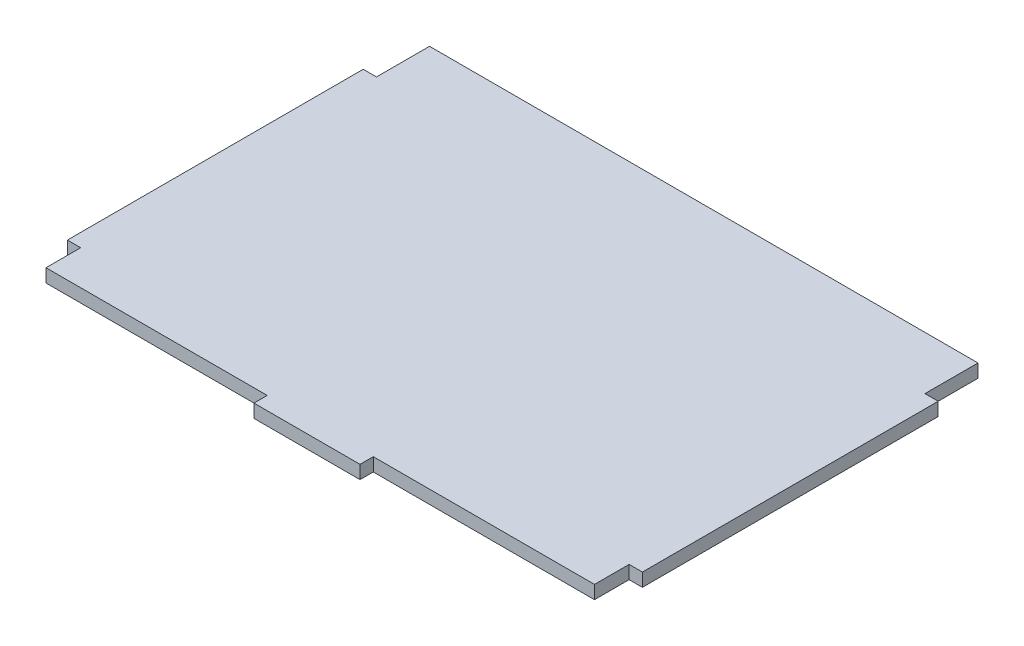
ISO-10303-21;
HEADER;
FILE_DESCRIPTION(('STEP AP214'),'2;1');
FILE_NAME('part.step','',(''),(''),'','','');
FILE_SCHEMA(('AUTOMOTIVE_DESIGN { 1 0 10303 214 1 1 1 1 }'));
ENDSEC;
DATA;
#1=APPLICATION_CONTEXT('core data for automotive mechanical design processes');
#2=APPLICATION_PROTOCOL_DEFINITION('international standard','automotive_design',2000,#1);
#3=PRODUCT_CONTEXT('',#1,'mechanical');
#4=PRODUCT('Part','Part','',(#3));
#5=PRODUCT_RELATED_PRODUCT_CATEGORY('part','',(#4));
#6=PRODUCT_DEFINITION_FORMATION('','',#4);
#7=PRODUCT_DEFINITION_CONTEXT('part definition',#1,'design');
#8=PRODUCT_DEFINITION('design','',#6,#7);
#9=PRODUCT_DEFINITION_SHAPE('','',#8);
#10=(LENGTH_UNIT() NAMED_UNIT(*) SI_UNIT(.MILLI.,.METRE.));
#11=(NAMED_UNIT(*) PLANE_ANGLE_UNIT() SI_UNIT($,.RADIAN.));
#12=(NAMED_UNIT(*) SI_UNIT($,.STERADIAN.) SOLID_ANGLE_UNIT());
#13=UNCERTAINTY_MEASURE_WITH_UNIT(LENGTH_MEASURE(1.E-05),#10,'distance_accuracy_value','');
#14=(GEOMETRIC_REPRESENTATION_CONTEXT(3) GLOBAL_UNCERTAINTY_ASSIGNED_CONTEXT((#13)) GLOBAL_UNIT_ASSIGNED_CONTEXT((#10,
#11,#12)) REPRESENTATION_CONTEXT('',''));
#15=CARTESIAN_POINT('',(0.,0.,0.));
#16=DIRECTION('',(0.,0.,1.));
#17=DIRECTION('',(1.,0.,0.));
#18=AXIS2_PLACEMENT_3D('',#15,#16,#17);
#19=CARTESIAN_POINT('',(12.7,3.175,47.498));
#20=DIRECTION('',(0.,0.,-1.));
#21=DIRECTION('',(-1.,0.,0.));
#22=AXIS2_PLACEMENT_3D('',#19,#20,#21);
#23=PLANE('',#22);
#24=DIRECTION('',(1.,0.,0.));
#25=VECTOR('',#24,1.);
#26=CARTESIAN_POINT('',(12.7,0.,47.498));
#27=LINE('',#26,#25);
#28=CARTESIAN_POINT('',(12.7,0.,47.498));
#29=VERTEX_POINT('',#28);
#30=CARTESIAN_POINT('',(65.659,0.,47.498));
#31=VERTEX_POINT('',#30);
#32=EDGE_CURVE('E177',#29,#31,#27,.T.);
#33=ORIENTED_EDGE('',*,*,#32,.T.);
#34=DIRECTION('',(0.,-1.,0.));
#35=VECTOR('',#34,1.);
#36=CARTESIAN_POINT('',(65.659,3.175,47.498));
#37=LINE('',#36,#35);
#38=CARTESIAN_POINT('',(65.659,3.175,47.498));
#39=VERTEX_POINT('',#38);
#40=EDGE_CURVE('E11',#39,#31,#37,.T.);
#41=ORIENTED_EDGE('',*,*,#40,.F.);
#42=DIRECTION('',(1.,0.,0.));
#43=VECTOR('',#42,1.);
#44=CARTESIAN_POINT('',(12.7,3.175,47.498));
#45=LINE('',#44,#43);
#46=CARTESIAN_POINT('',(12.7,3.175,47.498));
#47=VERTEX_POINT('',#46);
#48=EDGE_CURVE('E207',#47,#39,#45,.T.);
#49=ORIENTED_EDGE('',*,*,#48,.F.);
#50=DIRECTION('',(0.,-1.,0.));
#51=VECTOR('',#50,1.);
#52=CARTESIAN_POINT('',(12.7,3.175,47.498));
#53=LINE('',#52,#51);
#54=EDGE_CURVE('E173',#47,#29,#53,.T.);
#55=ORIENTED_EDGE('',*,*,#54,.T.);
#56=EDGE_LOOP('',(#33,#41,#49,#55));
#57=FACE_BOUND('',#56,.T.);
#58=ADVANCED_FACE('F33',(#57),#23,.F.);
#59=CARTESIAN_POINT('',(65.659,3.175,39.20277551));
#60=DIRECTION('',(-1.,0.,0.));
#61=DIRECTION('',(0.,0.,1.));
#62=AXIS2_PLACEMENT_3D('',#59,#60,#61);
#63=PLANE('',#62);
#64=DIRECTION('',(0.,0.,-1.));
#65=VECTOR('',#64,1.);
#66=CARTESIAN_POINT('',(65.659,0.,39.20277551));
#67=LINE('',#66,#65);
#68=CARTESIAN_POINT('',(65.659,0.,39.20277551));
#69=VERTEX_POINT('',#68);
#70=EDGE_CURVE('E180',#31,#69,#67,.T.);
#71=ORIENTED_EDGE('',*,*,#70,.T.);
#72=DIRECTION('',(0.,-1.,0.));
#73=VECTOR('',#72,1.);
#74=CARTESIAN_POINT('',(65.659,3.175,39.20277551));
#75=LINE('',#74,#73);
#76=CARTESIAN_POINT('',(65.659,3.175,39.20277551));
#77=VERTEX_POINT('',#76);
#78=EDGE_CURVE('E41',#77,#69,#75,.T.);
#79=ORIENTED_EDGE('',*,*,#78,.F.);
#80=DIRECTION('',(0.,0.,-1.));
#81=VECTOR('',#80,1.);
#82=CARTESIAN_POINT('',(65.659,3.175,39.20277551));
#83=LINE('',#82,#81);
#84=EDGE_CURVE('E116',#39,#77,#83,.T.);
#85=ORIENTED_EDGE('',*,*,#84,.F.);
#86=ORIENTED_EDGE('',*,*,#40,.T.);
#87=EDGE_LOOP('',(#71,#79,#85,#86));
#88=FACE_BOUND('',#87,.T.);
#89=ADVANCED_FACE('F305',(#88),#63,.F.);
#90=CARTESIAN_POINT('',(65.659,3.175,39.20277551));
#91=DIRECTION('',(0.,0.,-1.));
#92=DIRECTION('',(-1.,0.,0.));
#93=AXIS2_PLACEMENT_3D('',#90,#91,#92);
#94=PLANE('',#93);
#95=DIRECTION('',(1.,0.,0.));
#96=VECTOR('',#95,1.);
#97=CARTESIAN_POINT('',(65.659,0.,39.20277551));
#98=LINE('',#97,#96);
#99=CARTESIAN_POINT('',(68.834,0.,39.20277551));
#100=VERTEX_POINT('',#99);
#101=EDGE_CURVE('E182',#69,#100,#98,.T.);
#102=ORIENTED_EDGE('',*,*,#101,.T.);
#103=DIRECTION('',(0.,-1.,0.));
#104=VECTOR('',#103,1.);
#105=CARTESIAN_POINT('',(68.834,3.175,39.20277551));
#106=LINE('',#105,#104);
#107=CARTESIAN_POINT('',(68.834,3.175,39.20277551));
#108=VERTEX_POINT('',#107);
#109=EDGE_CURVE('E238',#108,#100,#106,.T.);
#110=ORIENTED_EDGE('',*,*,#109,.F.);
#111=DIRECTION('',(1.,0.,0.));
#112=VECTOR('',#111,1.);
#113=CARTESIAN_POINT('',(65.659,3.175,39.20277551));
#114=LINE('',#113,#112);
#115=EDGE_CURVE('E246',#77,#108,#114,.T.);
#116=ORIENTED_EDGE('',*,*,#115,.F.);
#117=ORIENTED_EDGE('',*,*,#78,.T.);
#118=EDGE_LOOP('',(#102,#110,#116,#117));
#119=FACE_BOUND('',#118,.T.);
#120=ADVANCED_FACE('F244',(#119),#94,.F.);
#121=CARTESIAN_POINT('',(68.834,3.175,39.20277551));
#122=DIRECTION('',(-1.,0.,0.));
#123=DIRECTION('',(0.,0.,1.));
#124=AXIS2_PLACEMENT_3D('',#121,#122,#123);
#125=PLANE('',#124);
#126=DIRECTION('',(0.,0.,-1.));
#127=VECTOR('',#126,1.);
#128=CARTESIAN_POINT('',(68.834,0.,39.20277551));
#129=LINE('',#128,#127);
#130=CARTESIAN_POINT('',(68.834,0.,-31.623));
#131=VERTEX_POINT('',#130);
#132=EDGE_CURVE('E184',#100,#131,#129,.T.);
#133=ORIENTED_EDGE('',*,*,#132,.T.);
#134=DIRECTION('',(0.,-1.,0.));
#135=VECTOR('',#134,1.);
#136=CARTESIAN_POINT('',(68.834,3.175,-31.623));
#137=LINE('',#136,#135);
#138=CARTESIAN_POINT('',(68.834,3.175,-31.623));
#139=VERTEX_POINT('',#138);
#140=EDGE_CURVE('E235',#139,#131,#137,.T.);
#141=ORIENTED_EDGE('',*,*,#140,.F.);
#142=DIRECTION('',(0.,0.,-1.));
#143=VECTOR('',#142,1.);
#144=CARTESIAN_POINT('',(68.834,3.175,39.20277551));
#145=LINE('',#144,#143);
#146=EDGE_CURVE('E264',#108,#139,#145,.T.);
#147=ORIENTED_EDGE('',*,*,#146,.F.);
#148=ORIENTED_EDGE('',*,*,#109,.T.);
#149=EDGE_LOOP('',(#133,#141,#147,#148));
#150=FACE_BOUND('',#149,.T.);
#151=ADVANCED_FACE('F255',(#150),#125,.F.);
#152=CARTESIAN_POINT('',(68.834,3.175,-31.623));
#153=DIRECTION('',(0.,0.,1.));
#154=DIRECTION('',(1.,0.,0.));
#155=AXIS2_PLACEMENT_3D('',#152,#153,#154);
#156=PLANE('',#155);
#157=DIRECTION('',(-1.,0.,0.));
#158=VECTOR('',#157,1.);
#159=CARTESIAN_POINT('',(68.834,0.,-31.623));
#160=LINE('',#159,#158);
#161=CARTESIAN_POINT('',(65.659,0.,-31.623));
#162=VERTEX_POINT('',#161);
#163=EDGE_CURVE('E186',#131,#162,#160,.T.);
#164=ORIENTED_EDGE('',*,*,#163,.T.);
#165=DIRECTION('',(0.,-1.,0.));
#166=VECTOR('',#165,1.);
#167=CARTESIAN_POINT('',(65.659,3.175,-31.623));
#168=LINE('',#167,#166);
#169=CARTESIAN_POINT('',(65.659,3.175,-31.623));
#170=VERTEX_POINT('',#169);
#171=EDGE_CURVE('E232',#170,#162,#168,.T.);
#172=ORIENTED_EDGE('',*,*,#171,.F.);
#173=DIRECTION('',(-1.,0.,0.));
#174=VECTOR('',#173,1.);
#175=CARTESIAN_POINT('',(68.834,3.175,-31.623));
#176=LINE('',#175,#174);
#177=EDGE_CURVE('E261',#139,#170,#176,.T.);
#178=ORIENTED_EDGE('',*,*,#177,.F.);
#179=ORIENTED_EDGE('',*,*,#140,.T.);
#180=EDGE_LOOP('',(#164,#172,#178,#179));
#181=FACE_BOUND('',#180,.T.);
#182=ADVANCED_FACE('F259',(#181),#156,.F.);
#183=CARTESIAN_POINT('',(65.659,3.175,-31.623));
#184=DIRECTION('',(-1.,0.,0.));
#185=DIRECTION('',(0.,0.,1.));
#186=AXIS2_PLACEMENT_3D('',#183,#184,#185);
#187=PLANE('',#186);
#188=DIRECTION('',(0.,0.,-1.));
#189=VECTOR('',#188,1.);
#190=CARTESIAN_POINT('',(65.659,0.,-31.623));
#191=LINE('',#190,#189);
#192=CARTESIAN_POINT('',(65.659,0.,-44.323));
#193=VERTEX_POINT('',#192);
#194=EDGE_CURVE('E188',#162,#193,#191,.T.);
#195=ORIENTED_EDGE('',*,*,#194,.T.);
#196=DIRECTION('',(0.,-1.,0.));
#197=VECTOR('',#196,1.);
#198=CARTESIAN_POINT('',(65.659,3.175,-44.323));
#199=LINE('',#198,#197);
#200=CARTESIAN_POINT('',(65.659,3.175,-44.323));
#201=VERTEX_POINT('',#200);
#202=EDGE_CURVE('E229',#201,#193,#199,.T.);
#203=ORIENTED_EDGE('',*,*,#202,.F.);
#204=DIRECTION('',(0.,0.,-1.));
#205=VECTOR('',#204,1.);
#206=CARTESIAN_POINT('',(65.659,3.175,-31.623));
#207=LINE('',#206,#205);
#208=EDGE_CURVE('E263',#170,#201,#207,.T.);
#209=ORIENTED_EDGE('',*,*,#208,.F.);
#210=ORIENTED_EDGE('',*,*,#171,.T.);
#211=EDGE_LOOP('',(#195,#203,#209,#210));
#212=FACE_BOUND('',#211,.T.);
#213=ADVANCED_FACE('F318',(#212),#187,.F.);
#214=CARTESIAN_POINT('',(-65.659,3.175,-44.323));
#215=DIRECTION('',(0.,0.,1.));
#216=DIRECTION('',(1.,0.,0.));
#217=AXIS2_PLACEMENT_3D('',#214,#215,#216);
#218=PLANE('',#217);
#219=DIRECTION('',(-1.,0.,0.));
#220=VECTOR('',#219,1.);
#221=CARTESIAN_POINT('',(-65.659,0.,-44.323));
#222=LINE('',#221,#220);
#223=CARTESIAN_POINT('',(-65.659,0.,-44.323));
#224=VERTEX_POINT('',#223);
#225=EDGE_CURVE('E190',#193,#224,#222,.T.);
#226=ORIENTED_EDGE('',*,*,#225,.T.);
#227=DIRECTION('',(0.,-1.,0.));
#228=VECTOR('',#227,1.);
#229=CARTESIAN_POINT('',(-65.659,3.175,-44.323));
#230=LINE('',#229,#228);
#231=CARTESIAN_POINT('',(-65.659,3.175,-44.323));
#232=VERTEX_POINT('',#231);
#233=EDGE_CURVE('E226',#232,#224,#230,.T.);
#234=ORIENTED_EDGE('',*,*,#233,.F.);
#235=DIRECTION('',(-1.,0.,0.));
#236=VECTOR('',#235,1.);
#237=CARTESIAN_POINT('',(-65.659,3.175,-44.323));
#238=LINE('',#237,#236);
#239=EDGE_CURVE('E266',#201,#232,#238,.T.);
#240=ORIENTED_EDGE('',*,*,#239,.F.);
#241=ORIENTED_EDGE('',*,*,#202,.T.);
#242=EDGE_LOOP('',(#226,#234,#240,#241));
#243=FACE_BOUND('',#242,.T.);
#244=ADVANCED_FACE('F321',(#243),#218,.F.);
#245=CARTESIAN_POINT('',(-65.659,3.175,-44.323));
#246=DIRECTION('',(1.,0.,0.));
#247=DIRECTION('',(0.,0.,-1.));
#248=AXIS2_PLACEMENT_3D('',#245,#246,#247);
#249=PLANE('',#248);
#250=DIRECTION('',(0.,0.,1.));
#251=VECTOR('',#250,1.);
#252=CARTESIAN_POINT('',(-65.659,0.,-44.323));
#253=LINE('',#252,#251);
#254=CARTESIAN_POINT('',(-65.659,0.,-31.623));
#255=VERTEX_POINT('',#254);
#256=EDGE_CURVE('E192',#224,#255,#253,.T.);
#257=ORIENTED_EDGE('',*,*,#256,.T.);
#258=DIRECTION('',(0.,-1.,0.));
#259=VECTOR('',#258,1.);
#260=CARTESIAN_POINT('',(-65.659,3.175,-31.623));
#261=LINE('',#260,#259);
#262=CARTESIAN_POINT('',(-65.659,3.175,-31.623));
#263=VERTEX_POINT('',#262);
#264=EDGE_CURVE('E223',#263,#255,#261,.T.);
#265=ORIENTED_EDGE('',*,*,#264,.F.);
#266=DIRECTION('',(0.,0.,1.));
#267=VECTOR('',#266,1.);
#268=CARTESIAN_POINT('',(-65.659,3.175,-44.323));
#269=LINE('',#268,#267);
#270=EDGE_CURVE('E272',#232,#263,#269,.T.);
#271=ORIENTED_EDGE('',*,*,#270,.F.);
#272=ORIENTED_EDGE('',*,*,#233,.T.);
#273=EDGE_LOOP('',(#257,#265,#271,#272));
#274=FACE_BOUND('',#273,.T.);
#275=ADVANCED_FACE('F325',(#274),#249,.F.);
#276=CARTESIAN_POINT('',(-68.834,3.175,-31.623));
#277=DIRECTION('',(0.,0.,1.));
#278=DIRECTION('',(1.,0.,0.));
#279=AXIS2_PLACEMENT_3D('',#276,#277,#278);
#280=PLANE('',#279);
#281=DIRECTION('',(-1.,0.,0.));
#282=VECTOR('',#281,1.);
#283=CARTESIAN_POINT('',(-68.834,0.,-31.623));
#284=LINE('',#283,#282);
#285=CARTESIAN_POINT('',(-68.834,0.,-31.623));
#286=VERTEX_POINT('',#285);
#287=EDGE_CURVE('E194',#255,#286,#284,.T.);
#288=ORIENTED_EDGE('',*,*,#287,.T.);
#289=DIRECTION('',(0.,-1.,0.));
#290=VECTOR('',#289,1.);
#291=CARTESIAN_POINT('',(-68.834,3.175,-31.623));
#292=LINE('',#291,#290);
#293=CARTESIAN_POINT('',(-68.834,3.175,-31.623));
#294=VERTEX_POINT('',#293);
#295=EDGE_CURVE('E220',#294,#286,#292,.T.);
#296=ORIENTED_EDGE('',*,*,#295,.F.);
#297=DIRECTION('',(-1.,0.,0.));
#298=VECTOR('',#297,1.);
#299=CARTESIAN_POINT('',(-68.834,3.175,-31.623));
#300=LINE('',#299,#298);
#301=EDGE_CURVE('E274',#263,#294,#300,.T.);
#302=ORIENTED_EDGE('',*,*,#301,.F.);
#303=ORIENTED_EDGE('',*,*,#264,.T.);
#304=EDGE_LOOP('',(#288,#296,#302,#303));
#305=FACE_BOUND('',#304,.T.);
#306=ADVANCED_FACE('F329',(#305),#280,.F.);
#307=CARTESIAN_POINT('',(-68.834,3.175,39.20277551));
#308=DIRECTION('',(1.,0.,0.));
#309=DIRECTION('',(0.,0.,-1.));
#310=AXIS2_PLACEMENT_3D('',#307,#308,#309);
#311=PLANE('',#310);
#312=DIRECTION('',(0.,0.,1.));
#313=VECTOR('',#312,1.);
#314=CARTESIAN_POINT('',(-68.834,0.,39.20277551));
#315=LINE('',#314,#313);
#316=CARTESIAN_POINT('',(-68.834,0.,39.20277551));
#317=VERTEX_POINT('',#316);
#318=EDGE_CURVE('E196',#286,#317,#315,.T.);
#319=ORIENTED_EDGE('',*,*,#318,.T.);
#320=DIRECTION('',(0.,-1.,0.));
#321=VECTOR('',#320,1.);
#322=CARTESIAN_POINT('',(-68.834,3.175,39.20277551));
#323=LINE('',#322,#321);
#324=CARTESIAN_POINT('',(-68.834,3.175,39.20277551));
#325=VERTEX_POINT('',#324);
#326=EDGE_CURVE('E217',#325,#317,#323,.T.);
#327=ORIENTED_EDGE('',*,*,#326,.F.);
#328=DIRECTION('',(0.,0.,1.));
#329=VECTOR('',#328,1.);
#330=CARTESIAN_POINT('',(-68.834,3.175,39.20277551));
#331=LINE('',#330,#329);
#332=EDGE_CURVE('E276',#294,#325,#331,.T.);
#333=ORIENTED_EDGE('',*,*,#332,.F.);
#334=ORIENTED_EDGE('',*,*,#295,.T.);
#335=EDGE_LOOP('',(#319,#327,#333,#334));
#336=FACE_BOUND('',#335,.T.);
#337=ADVANCED_FACE('F333',(#336),#311,.F.);
#338=CARTESIAN_POINT('',(-65.659,3.175,39.20277551));
#339=DIRECTION('',(0.,0.,-1.));
#340=DIRECTION('',(-1.,0.,0.));
#341=AXIS2_PLACEMENT_3D('',#338,#339,#340);
#342=PLANE('',#341);
#343=DIRECTION('',(1.,0.,0.));
#344=VECTOR('',#343,1.);
#345=CARTESIAN_POINT('',(-65.659,0.,39.20277551));
#346=LINE('',#345,#344);
#347=CARTESIAN_POINT('',(-65.659,0.,39.20277551));
#348=VERTEX_POINT('',#347);
#349=EDGE_CURVE('E198',#317,#348,#346,.T.);
#350=ORIENTED_EDGE('',*,*,#349,.T.);
#351=DIRECTION('',(0.,-1.,0.));
#352=VECTOR('',#351,1.);
#353=CARTESIAN_POINT('',(-65.659,3.175,39.20277551));
#354=LINE('',#353,#352);
#355=CARTESIAN_POINT('',(-65.659,3.175,39.20277551));
#356=VERTEX_POINT('',#355);
#357=EDGE_CURVE('E214',#356,#348,#354,.T.);
#358=ORIENTED_EDGE('',*,*,#357,.F.);
#359=DIRECTION('',(1.,0.,0.));
#360=VECTOR('',#359,1.);
#361=CARTESIAN_POINT('',(-65.659,3.175,39.20277551));
#362=LINE('',#361,#360);
#363=EDGE_CURVE('E278',#325,#356,#362,.T.);
#364=ORIENTED_EDGE('',*,*,#363,.F.);
#365=ORIENTED_EDGE('',*,*,#326,.T.);
#366=EDGE_LOOP('',(#350,#358,#364,#365));
#367=FACE_BOUND('',#366,.T.);
#368=ADVANCED_FACE('F337',(#367),#342,.F.);
#369=CARTESIAN_POINT('',(-65.659,3.175,39.20277551));
#370=DIRECTION('',(1.,0.,0.));
#371=DIRECTION('',(0.,0.,-1.));
#372=AXIS2_PLACEMENT_3D('',#369,#370,#371);
#373=PLANE('',#372);
#374=DIRECTION('',(0.,0.,1.));
#375=VECTOR('',#374,1.);
#376=CARTESIAN_POINT('',(-65.659,0.,39.20277551));
#377=LINE('',#376,#375);
#378=CARTESIAN_POINT('',(-65.659,0.,47.498));
#379=VERTEX_POINT('',#378);
#380=EDGE_CURVE('E200',#348,#379,#377,.T.);
#381=ORIENTED_EDGE('',*,*,#380,.T.);
#382=DIRECTION('',(0.,-1.,0.));
#383=VECTOR('',#382,1.);
#384=CARTESIAN_POINT('',(-65.659,3.175,47.498));
#385=LINE('',#384,#383);
#386=CARTESIAN_POINT('',(-65.659,3.175,47.498));
#387=VERTEX_POINT('',#386);
#388=EDGE_CURVE('E211',#387,#379,#385,.T.);
#389=ORIENTED_EDGE('',*,*,#388,.F.);
#390=DIRECTION('',(0.,0.,1.));
#391=VECTOR('',#390,1.);
#392=CARTESIAN_POINT('',(-65.659,3.175,39.20277551));
#393=LINE('',#392,#391);
#394=EDGE_CURVE('E280',#356,#387,#393,.T.);
#395=ORIENTED_EDGE('',*,*,#394,.F.);
#396=ORIENTED_EDGE('',*,*,#357,.T.);
#397=EDGE_LOOP('',(#381,#389,#395,#396));
#398=FACE_BOUND('',#397,.T.);
#399=ADVANCED_FACE('F286',(#398),#373,.F.);
#400=CARTESIAN_POINT('',(-65.659,3.175,47.498));
#401=DIRECTION('',(0.,0.,-1.));
#402=DIRECTION('',(-1.,0.,0.));
#403=AXIS2_PLACEMENT_3D('',#400,#401,#402);
#404=PLANE('',#403);
#405=DIRECTION('',(1.,0.,0.));
#406=VECTOR('',#405,1.);
#407=CARTESIAN_POINT('',(-65.659,0.,47.498));
#408=LINE('',#407,#406);
#409=CARTESIAN_POINT('',(-12.7,0.,47.498));
#410=VERTEX_POINT('',#409);
#411=EDGE_CURVE('E202',#379,#410,#408,.T.);
#412=ORIENTED_EDGE('',*,*,#411,.T.);
#413=DIRECTION('',(0.,-1.,0.));
#414=VECTOR('',#413,1.);
#415=CARTESIAN_POINT('',(-12.7,3.175,47.498));
#416=LINE('',#415,#414);
#417=CARTESIAN_POINT('',(-12.7,3.175,47.498));
#418=VERTEX_POINT('',#417);
#419=EDGE_CURVE('E168',#418,#410,#416,.T.);
#420=ORIENTED_EDGE('',*,*,#419,.F.);
#421=DIRECTION('',(1.,0.,0.));
#422=VECTOR('',#421,1.);
#423=CARTESIAN_POINT('',(-65.659,3.175,47.498));
#424=LINE('',#423,#422);
#425=EDGE_CURVE('E159',#387,#418,#424,.T.);
#426=ORIENTED_EDGE('',*,*,#425,.F.);
#427=ORIENTED_EDGE('',*,*,#388,.T.);
#428=EDGE_LOOP('',(#412,#420,#426,#427));
#429=FACE_BOUND('',#428,.T.);
#430=ADVANCED_FACE('F290',(#429),#404,.F.);
#431=CARTESIAN_POINT('',(-12.7,3.175,47.498));
#432=DIRECTION('',(1.,0.,0.));
#433=DIRECTION('',(0.,0.,-1.));
#434=AXIS2_PLACEMENT_3D('',#431,#432,#433);
#435=PLANE('',#434);
#436=DIRECTION('',(0.,0.,1.));
#437=VECTOR('',#436,1.);
#438=CARTESIAN_POINT('',(-12.7,0.,47.498));
#439=LINE('',#438,#437);
#440=CARTESIAN_POINT('',(-12.7,0.,50.673));
#441=VERTEX_POINT('',#440);
#442=EDGE_CURVE('E167',#410,#441,#439,.T.);
#443=ORIENTED_EDGE('',*,*,#442,.T.);
#444=DIRECTION('',(0.,-1.,0.));
#445=VECTOR('',#444,1.);
#446=CARTESIAN_POINT('',(-12.7,3.175,50.673));
#447=LINE('',#446,#445);
#448=CARTESIAN_POINT('',(-12.7,3.175,50.673));
#449=VERTEX_POINT('',#448);
#450=EDGE_CURVE('E164',#449,#441,#447,.T.);
#451=ORIENTED_EDGE('',*,*,#450,.F.);
#452=DIRECTION('',(0.,0.,1.));
#453=VECTOR('',#452,1.);
#454=CARTESIAN_POINT('',(-12.7,3.175,47.498));
#455=LINE('',#454,#453);
#456=EDGE_CURVE('E153',#418,#449,#455,.T.);
#457=ORIENTED_EDGE('',*,*,#456,.F.);
#458=ORIENTED_EDGE('',*,*,#419,.T.);
#459=EDGE_LOOP('',(#443,#451,#457,#458));
#460=FACE_BOUND('',#459,.T.);
#461=ADVANCED_FACE('F165',(#460),#435,.F.);
#462=CARTESIAN_POINT('',(-12.7,3.175,50.673));
#463=DIRECTION('',(0.,0.,-1.));
#464=DIRECTION('',(-1.,0.,0.));
#465=AXIS2_PLACEMENT_3D('',#462,#463,#464);
#466=PLANE('',#465);
#467=DIRECTION('',(1.,0.,0.));
#468=VECTOR('',#467,1.);
#469=CARTESIAN_POINT('',(-12.7,0.,50.673));
#470=LINE('',#469,#468);
#471=CARTESIAN_POINT('',(12.7,0.,50.673));
#472=VERTEX_POINT('',#471);
#473=EDGE_CURVE('E102',#441,#472,#470,.T.);
#474=ORIENTED_EDGE('',*,*,#473,.T.);
#475=DIRECTION('',(0.,-1.,0.));
#476=VECTOR('',#475,1.);
#477=CARTESIAN_POINT('',(12.7,3.175,50.673));
#478=LINE('',#477,#476);
#479=CARTESIAN_POINT('',(12.7,3.175,50.673));
#480=VERTEX_POINT('',#479);
#481=EDGE_CURVE('E169',#480,#472,#478,.T.);
#482=ORIENTED_EDGE('',*,*,#481,.F.);
#483=DIRECTION('',(1.,0.,0.));
#484=VECTOR('',#483,1.);
#485=CARTESIAN_POINT('',(-12.7,3.175,50.673));
#486=LINE('',#485,#484);
#487=EDGE_CURVE('E157',#449,#480,#486,.T.);
#488=ORIENTED_EDGE('',*,*,#487,.F.);
#489=ORIENTED_EDGE('',*,*,#450,.T.);
#490=EDGE_LOOP('',(#474,#482,#488,#489));
#491=FACE_BOUND('',#490,.T.);
#492=ADVANCED_FACE('F171',(#491),#466,.F.);
#493=CARTESIAN_POINT('',(12.7,3.175,50.673));
#494=DIRECTION('',(-1.,0.,0.));
#495=DIRECTION('',(0.,0.,1.));
#496=AXIS2_PLACEMENT_3D('',#493,#494,#495);
#497=PLANE('',#496);
#498=DIRECTION('',(0.,0.,-1.));
#499=VECTOR('',#498,1.);
#500=CARTESIAN_POINT('',(12.7,0.,50.673));
#501=LINE('',#500,#499);
#502=EDGE_CURVE('E108',#472,#29,#501,.T.);
#503=ORIENTED_EDGE('',*,*,#502,.T.);
#504=ORIENTED_EDGE('',*,*,#54,.F.);
#505=DIRECTION('',(0.,0.,-1.));
#506=VECTOR('',#505,1.);
#507=CARTESIAN_POINT('',(12.7,3.175,50.673));
#508=LINE('',#507,#506);
#509=EDGE_CURVE('E49',#480,#47,#508,.T.);
#510=ORIENTED_EDGE('',*,*,#509,.F.);
#511=ORIENTED_EDGE('',*,*,#481,.T.);
#512=EDGE_LOOP('',(#503,#504,#510,#511));
#513=FACE_BOUND('',#512,.T.);
#514=ADVANCED_FACE('F294',(#513),#497,.F.);
#515=CARTESIAN_POINT('',(0.,3.175,0.));
#516=DIRECTION('',(0.,-1.,0.));
#517=DIRECTION('',(0.,0.,-1.));
#518=AXIS2_PLACEMENT_3D('',#515,#516,#517);
#519=PLANE('',#518);
#520=ORIENTED_EDGE('',*,*,#48,.T.);
#521=ORIENTED_EDGE('',*,*,#84,.T.);
#522=ORIENTED_EDGE('',*,*,#115,.T.);
#523=ORIENTED_EDGE('',*,*,#146,.T.);
#524=ORIENTED_EDGE('',*,*,#177,.T.);
#525=ORIENTED_EDGE('',*,*,#208,.T.);
#526=ORIENTED_EDGE('',*,*,#239,.T.);
#527=ORIENTED_EDGE('',*,*,#270,.T.);
#528=ORIENTED_EDGE('',*,*,#301,.T.);
#529=ORIENTED_EDGE('',*,*,#332,.T.);
#530=ORIENTED_EDGE('',*,*,#363,.T.);
#531=ORIENTED_EDGE('',*,*,#394,.T.);
#532=ORIENTED_EDGE('',*,*,#425,.T.);
#533=ORIENTED_EDGE('',*,*,#456,.T.);
#534=ORIENTED_EDGE('',*,*,#487,.T.);
#535=ORIENTED_EDGE('',*,*,#509,.T.);
#536=EDGE_LOOP('',(#520,#521,#522,#523,#524,#525,#526,#527,#528,#529,#530,#531,#532,#533,#534,#535));
#537=FACE_BOUND('',#536,.T.);
#538=ADVANCED_FACE('F155',(#537),#519,.F.);
#539=CARTESIAN_POINT('',(0.,0.,0.));
#540=DIRECTION('',(0.,-1.,0.));
#541=DIRECTION('',(0.,0.,-1.));
#542=AXIS2_PLACEMENT_3D('',#539,#540,#541);
#543=PLANE('',#542);
#544=ORIENTED_EDGE('',*,*,#32,.F.);
#545=ORIENTED_EDGE('',*,*,#502,.F.);
#546=ORIENTED_EDGE('',*,*,#473,.F.);
#547=ORIENTED_EDGE('',*,*,#442,.F.);
#548=ORIENTED_EDGE('',*,*,#411,.F.);
#549=ORIENTED_EDGE('',*,*,#380,.F.);
#550=ORIENTED_EDGE('',*,*,#349,.F.);
#551=ORIENTED_EDGE('',*,*,#318,.F.);
#552=ORIENTED_EDGE('',*,*,#287,.F.);
#553=ORIENTED_EDGE('',*,*,#256,.F.);
#554=ORIENTED_EDGE('',*,*,#225,.F.);
#555=ORIENTED_EDGE('',*,*,#194,.F.);
#556=ORIENTED_EDGE('',*,*,#163,.F.);
#557=ORIENTED_EDGE('',*,*,#132,.F.);
#558=ORIENTED_EDGE('',*,*,#101,.F.);
#559=ORIENTED_EDGE('',*,*,#70,.F.);
#560=EDGE_LOOP('',(#544,#545,#546,#547,#548,#549,#550,#551,#552,#553,#554,#555,#556,#557,#558,#559));
#561=FACE_BOUND('',#560,.T.);
#562=ADVANCED_FACE('F250',(#561),#543,.T.);
#563=CLOSED_SHELL('',(#58,#89,#120,#151,#182,#213,#244,#275,#306,#337,#368,#399,#430,#461,#492,
#514,#538,#562));
#564=MANIFOLD_SOLID_BREP('B2',#563);
#565=ADVANCED_BREP_SHAPE_REPRESENTATION('',(#18,#564),#14);
#566=SHAPE_DEFINITION_REPRESENTATION(#9,#565);
ENDSEC;
END-ISO-10303-21;
